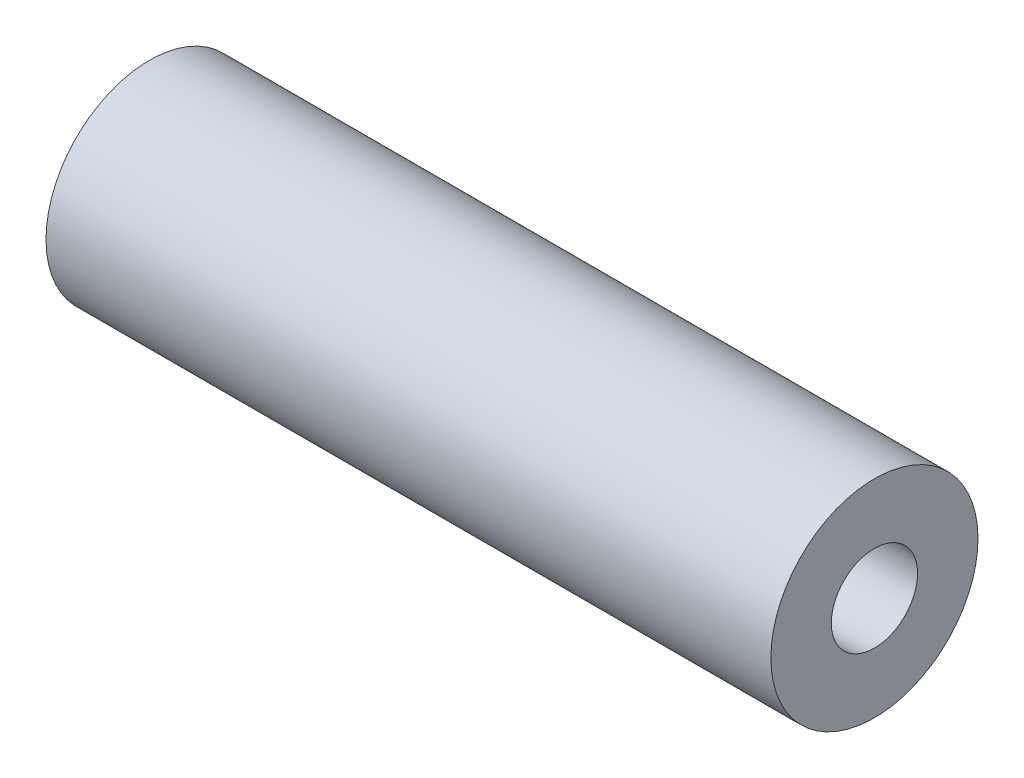
ISO-10303-21;
HEADER;
FILE_DESCRIPTION(('STEP AP214'),'2;1');
FILE_NAME('part.step','',(''),(''),'','','');
FILE_SCHEMA(('AUTOMOTIVE_DESIGN { 1 0 10303 214 1 1 1 1 }'));
ENDSEC;
DATA;
#1=APPLICATION_CONTEXT('core data for automotive mechanical design processes');
#2=APPLICATION_PROTOCOL_DEFINITION('international standard','automotive_design',2000,#1);
#3=PRODUCT_CONTEXT('',#1,'mechanical');
#4=PRODUCT('Part','Part','',(#3));
#5=PRODUCT_RELATED_PRODUCT_CATEGORY('part','',(#4));
#6=PRODUCT_DEFINITION_FORMATION('','',#4);
#7=PRODUCT_DEFINITION_CONTEXT('part definition',#1,'design');
#8=PRODUCT_DEFINITION('design','',#6,#7);
#9=PRODUCT_DEFINITION_SHAPE('','',#8);
#10=(LENGTH_UNIT() NAMED_UNIT(*) SI_UNIT(.MILLI.,.METRE.));
#11=(NAMED_UNIT(*) PLANE_ANGLE_UNIT() SI_UNIT($,.RADIAN.));
#12=(NAMED_UNIT(*) SI_UNIT($,.STERADIAN.) SOLID_ANGLE_UNIT());
#13=UNCERTAINTY_MEASURE_WITH_UNIT(LENGTH_MEASURE(1.E-05),#10,'distance_accuracy_value','');
#14=(GEOMETRIC_REPRESENTATION_CONTEXT(3) GLOBAL_UNCERTAINTY_ASSIGNED_CONTEXT((#13)) GLOBAL_UNIT_ASSIGNED_CONTEXT((#10,
#11,#12)) REPRESENTATION_CONTEXT('',''));
#15=CARTESIAN_POINT('',(0.,0.,0.));
#16=DIRECTION('',(0.,0.,1.));
#17=DIRECTION('',(1.,0.,0.));
#18=AXIS2_PLACEMENT_3D('',#15,#16,#17);
#19=CARTESIAN_POINT('',(21.,0.,0.));
#20=DIRECTION('',(-1.,0.,0.));
#21=DIRECTION('',(0.,0.,1.));
#22=AXIS2_PLACEMENT_3D('',#19,#20,#21);
#23=CYLINDRICAL_SURFACE('',#22,3.);
#24=CARTESIAN_POINT('',(21.,0.,0.));
#25=DIRECTION('',(1.,0.,0.));
#26=DIRECTION('',(0.,0.,-1.));
#27=AXIS2_PLACEMENT_3D('',#24,#25,#26);
#28=CIRCLE('',#27,3.);
#29=CARTESIAN_POINT('',(21.,0.,3.));
#30=VERTEX_POINT('',#29);
#31=EDGE_CURVE('E10',#30,#30,#28,.T.);
#32=CARTESIAN_POINT('',(0.,0.,0.));
#33=DIRECTION('',(1.,0.,0.));
#34=DIRECTION('',(0.,0.,-1.));
#35=AXIS2_PLACEMENT_3D('',#32,#33,#34);
#36=CIRCLE('',#35,3.);
#37=CARTESIAN_POINT('',(0.,0.,3.));
#38=VERTEX_POINT('',#37);
#39=EDGE_CURVE('E37',#38,#38,#36,.T.);
#40=CARTESIAN_POINT('',(21.,0.,3.));
#41=CARTESIAN_POINT('',(20.78125,0.,3.));
#42=CARTESIAN_POINT('',(20.5625,0.,3.));
#43=CARTESIAN_POINT('',(20.125,0.,3.));
#44=CARTESIAN_POINT('',(19.90625,0.,3.));
#45=CARTESIAN_POINT('',(19.46875,0.,3.));
#46=CARTESIAN_POINT('',(19.25,0.,3.));
#47=CARTESIAN_POINT('',(18.8125,0.,3.));
#48=CARTESIAN_POINT('',(18.59375,0.,3.));
#49=CARTESIAN_POINT('',(18.15625,0.,3.));
#50=CARTESIAN_POINT('',(17.9375,0.,3.));
#51=CARTESIAN_POINT('',(17.5,0.,3.));
#52=CARTESIAN_POINT('',(17.28125,0.,3.));
#53=CARTESIAN_POINT('',(16.84375,0.,3.));
#54=CARTESIAN_POINT('',(16.625,0.,3.));
#55=CARTESIAN_POINT('',(16.1875,0.,3.));
#56=CARTESIAN_POINT('',(15.96875,0.,3.));
#57=CARTESIAN_POINT('',(15.53125,0.,3.));
#58=CARTESIAN_POINT('',(15.3125,0.,3.));
#59=CARTESIAN_POINT('',(14.875,0.,3.));
#60=CARTESIAN_POINT('',(14.65625,0.,3.));
#61=CARTESIAN_POINT('',(14.21875,0.,3.));
#62=CARTESIAN_POINT('',(14.,0.,3.));
#63=CARTESIAN_POINT('',(13.5625,0.,3.));
#64=CARTESIAN_POINT('',(13.34375,0.,3.));
#65=CARTESIAN_POINT('',(12.90625,0.,3.));
#66=CARTESIAN_POINT('',(12.6875,0.,3.));
#67=CARTESIAN_POINT('',(12.25,0.,3.));
#68=CARTESIAN_POINT('',(12.03125,0.,3.));
#69=CARTESIAN_POINT('',(11.59375,0.,3.));
#70=CARTESIAN_POINT('',(11.375,0.,3.));
#71=CARTESIAN_POINT('',(10.9375,0.,3.));
#72=CARTESIAN_POINT('',(10.71875,0.,3.));
#73=CARTESIAN_POINT('',(10.28125,0.,3.));
#74=CARTESIAN_POINT('',(10.0625,0.,3.));
#75=CARTESIAN_POINT('',(9.625,0.,3.));
#76=CARTESIAN_POINT('',(9.40625,0.,3.));
#77=CARTESIAN_POINT('',(8.96875,0.,3.));
#78=CARTESIAN_POINT('',(8.75,0.,3.));
#79=CARTESIAN_POINT('',(8.3125,0.,3.));
#80=CARTESIAN_POINT('',(8.09375,0.,3.));
#81=CARTESIAN_POINT('',(7.65625,0.,3.));
#82=CARTESIAN_POINT('',(7.4375,0.,3.));
#83=CARTESIAN_POINT('',(7.,0.,3.));
#84=CARTESIAN_POINT('',(6.78125,0.,3.));
#85=CARTESIAN_POINT('',(6.34375,0.,3.));
#86=CARTESIAN_POINT('',(6.125,0.,3.));
#87=CARTESIAN_POINT('',(5.6875,0.,3.));
#88=CARTESIAN_POINT('',(5.46875,0.,3.));
#89=CARTESIAN_POINT('',(5.03125,0.,3.));
#90=CARTESIAN_POINT('',(4.8125,0.,3.));
#91=CARTESIAN_POINT('',(4.375,0.,3.));
#92=CARTESIAN_POINT('',(4.15625,0.,3.));
#93=CARTESIAN_POINT('',(3.71875,0.,3.));
#94=CARTESIAN_POINT('',(3.5,0.,3.));
#95=CARTESIAN_POINT('',(3.0625,0.,3.));
#96=CARTESIAN_POINT('',(2.84375,0.,3.));
#97=CARTESIAN_POINT('',(2.40625,0.,3.));
#98=CARTESIAN_POINT('',(2.1875,0.,3.));
#99=CARTESIAN_POINT('',(1.75,0.,3.));
#100=CARTESIAN_POINT('',(1.53125,0.,3.));
#101=CARTESIAN_POINT('',(1.09375,0.,3.));
#102=CARTESIAN_POINT('',(0.875000000000001,0.,3.));
#103=CARTESIAN_POINT('',(0.4375,0.,3.));
#104=CARTESIAN_POINT('',(0.21875,0.,3.));
#105=CARTESIAN_POINT('',(0.,0.,3.));
#106=B_SPLINE_CURVE_WITH_KNOTS('',3,(#40,#41,#42,#43,#44,#45,#46,#47,#48,#49,#50,#51,#52,#53,
#54,#55,#56,#57,#58,#59,#60,#61,#62,#63,#64,#65,#66,#67,#68,#69,#70,#71,#72,#73,#74,#75,#76,#77,
#78,#79,#80,#81,#82,#83,#84,#85,#86,#87,#88,#89,#90,#91,#92,#93,#94,#95,#96,#97,#98,#99,#100,
#101,#102,#103,#104,#105),.UNSPECIFIED.,.F.,.F.,(4,2,2,2,2,2,2,2,2,2,2,2,2,2,2,2,2,2,2,2,2,2,2,
2,2,2,2,2,2,2,2,2,4),(0.,0.656249999999997,1.3125,1.96875,2.625,3.28125,3.9375,4.59375,5.25,
5.90625,6.5625,7.21875,7.875,8.53125,9.1875,9.84375,10.5,11.15625,11.8125,12.46875,13.125,
13.78125,14.4375,15.09375,15.75,16.40625,17.0625,17.71875,18.375,19.03125,19.6875,20.34375,21.),.UNSPECIFIED.);
#107=EDGE_CURVE('BSEAM34',#30,#38,#106,.T.);
#108=ORIENTED_EDGE('',*,*,#31,.F.);
#109=ORIENTED_EDGE('',*,*,#39,.T.);
#110=ORIENTED_EDGE('',*,*,#107,.T.);
#111=ORIENTED_EDGE('',*,*,#107,.F.);
#112=EDGE_LOOP('',(#108,#110,#109,#111));
#113=FACE_BOUND('',#112,.T.);
#114=ADVANCED_FACE('F34',(#113),#23,.T.);
#115=CARTESIAN_POINT('',(21.,0.,0.));
#116=DIRECTION('',(1.,0.,0.));
#117=DIRECTION('',(0.,0.,-1.));
#118=AXIS2_PLACEMENT_3D('',#115,#116,#117);
#119=PLANE('',#118);
#120=CARTESIAN_POINT('',(21.,0.,0.));
#121=DIRECTION('',(-1.,0.,0.));
#122=DIRECTION('',(0.,0.,1.));
#123=AXIS2_PLACEMENT_3D('',#120,#121,#122);
#124=CIRCLE('',#123,1.25);
#125=CARTESIAN_POINT('',(21.,0.,1.25));
#126=VERTEX_POINT('',#125);
#127=EDGE_CURVE('E44',#126,#126,#124,.T.);
#128=ORIENTED_EDGE('',*,*,#127,.T.);
#129=EDGE_LOOP('',(#128));
#130=FACE_BOUND('',#129,.T.);
#131=ORIENTED_EDGE('',*,*,#31,.T.);
#132=EDGE_LOOP('',(#131));
#133=FACE_BOUND('',#132,.T.);
#134=ADVANCED_FACE('F52',(#130,#133),#119,.T.);
#135=CARTESIAN_POINT('',(0.,0.,0.));
#136=DIRECTION('',(1.,0.,0.));
#137=DIRECTION('',(0.,0.,-1.));
#138=AXIS2_PLACEMENT_3D('',#135,#136,#137);
#139=PLANE('',#138);
#140=CARTESIAN_POINT('',(0.,0.,0.));
#141=DIRECTION('',(-1.,0.,0.));
#142=DIRECTION('',(0.,0.,1.));
#143=AXIS2_PLACEMENT_3D('',#140,#141,#142);
#144=CIRCLE('',#143,1.25);
#145=CARTESIAN_POINT('',(0.,0.,1.25));
#146=VERTEX_POINT('',#145);
#147=EDGE_CURVE('E46',#146,#146,#144,.T.);
#148=ORIENTED_EDGE('',*,*,#147,.F.);
#149=EDGE_LOOP('',(#148));
#150=FACE_BOUND('',#149,.T.);
#151=ORIENTED_EDGE('',*,*,#39,.F.);
#152=EDGE_LOOP('',(#151));
#153=FACE_BOUND('',#152,.T.);
#154=ADVANCED_FACE('F57',(#150,#153),#139,.F.);
#155=CARTESIAN_POINT('',(21.,0.,0.));
#156=DIRECTION('',(-1.,0.,0.));
#157=DIRECTION('',(0.,0.,1.));
#158=AXIS2_PLACEMENT_3D('',#155,#156,#157);
#159=CYLINDRICAL_SURFACE('',#158,1.25);
#160=CARTESIAN_POINT('',(21.,0.,1.25));
#161=CARTESIAN_POINT('',(20.78125,0.,1.25));
#162=CARTESIAN_POINT('',(20.5625,0.,1.25));
#163=CARTESIAN_POINT('',(20.125,0.,1.25));
#164=CARTESIAN_POINT('',(19.90625,0.,1.25));
#165=CARTESIAN_POINT('',(19.46875,0.,1.25));
#166=CARTESIAN_POINT('',(19.25,0.,1.25));
#167=CARTESIAN_POINT('',(18.8125,0.,1.25));
#168=CARTESIAN_POINT('',(18.59375,0.,1.25));
#169=CARTESIAN_POINT('',(18.15625,0.,1.25));
#170=CARTESIAN_POINT('',(17.9375,0.,1.25));
#171=CARTESIAN_POINT('',(17.5,0.,1.25));
#172=CARTESIAN_POINT('',(17.28125,0.,1.25));
#173=CARTESIAN_POINT('',(16.84375,0.,1.25));
#174=CARTESIAN_POINT('',(16.625,0.,1.25));
#175=CARTESIAN_POINT('',(16.1875,0.,1.25));
#176=CARTESIAN_POINT('',(15.96875,0.,1.25));
#177=CARTESIAN_POINT('',(15.53125,0.,1.25));
#178=CARTESIAN_POINT('',(15.3125,0.,1.25));
#179=CARTESIAN_POINT('',(14.875,0.,1.25));
#180=CARTESIAN_POINT('',(14.65625,0.,1.25));
#181=CARTESIAN_POINT('',(14.21875,0.,1.25));
#182=CARTESIAN_POINT('',(14.,0.,1.25));
#183=CARTESIAN_POINT('',(13.5625,0.,1.25));
#184=CARTESIAN_POINT('',(13.34375,0.,1.25));
#185=CARTESIAN_POINT('',(12.90625,0.,1.25));
#186=CARTESIAN_POINT('',(12.6875,0.,1.25));
#187=CARTESIAN_POINT('',(12.25,0.,1.25));
#188=CARTESIAN_POINT('',(12.03125,0.,1.25));
#189=CARTESIAN_POINT('',(11.59375,0.,1.25));
#190=CARTESIAN_POINT('',(11.375,0.,1.25));
#191=CARTESIAN_POINT('',(10.9375,0.,1.25));
#192=CARTESIAN_POINT('',(10.71875,0.,1.25));
#193=CARTESIAN_POINT('',(10.28125,0.,1.25));
#194=CARTESIAN_POINT('',(10.0625,0.,1.25));
#195=CARTESIAN_POINT('',(9.625,0.,1.25));
#196=CARTESIAN_POINT('',(9.40625,0.,1.25));
#197=CARTESIAN_POINT('',(8.96875,0.,1.25));
#198=CARTESIAN_POINT('',(8.75,0.,1.25));
#199=CARTESIAN_POINT('',(8.3125,0.,1.25));
#200=CARTESIAN_POINT('',(8.09375,0.,1.25));
#201=CARTESIAN_POINT('',(7.65625,0.,1.25));
#202=CARTESIAN_POINT('',(7.4375,0.,1.25));
#203=CARTESIAN_POINT('',(7.,0.,1.25));
#204=CARTESIAN_POINT('',(6.78125,0.,1.25));
#205=CARTESIAN_POINT('',(6.34375,0.,1.25));
#206=CARTESIAN_POINT('',(6.125,0.,1.25));
#207=CARTESIAN_POINT('',(5.6875,0.,1.25));
#208=CARTESIAN_POINT('',(5.46875,0.,1.25));
#209=CARTESIAN_POINT('',(5.03125,0.,1.25));
#210=CARTESIAN_POINT('',(4.8125,0.,1.25));
#211=CARTESIAN_POINT('',(4.375,0.,1.25));
#212=CARTESIAN_POINT('',(4.15625,0.,1.25));
#213=CARTESIAN_POINT('',(3.71875,0.,1.25));
#214=CARTESIAN_POINT('',(3.5,0.,1.25));
#215=CARTESIAN_POINT('',(3.0625,0.,1.25));
#216=CARTESIAN_POINT('',(2.84375,0.,1.25));
#217=CARTESIAN_POINT('',(2.40625,0.,1.25));
#218=CARTESIAN_POINT('',(2.1875,0.,1.25));
#219=CARTESIAN_POINT('',(1.75,0.,1.25));
#220=CARTESIAN_POINT('',(1.53125,0.,1.25));
#221=CARTESIAN_POINT('',(1.09375,0.,1.25));
#222=CARTESIAN_POINT('',(0.875000000000001,0.,1.25));
#223=CARTESIAN_POINT('',(0.4375,0.,1.25));
#224=CARTESIAN_POINT('',(0.21875,0.,1.25));
#225=CARTESIAN_POINT('',(0.,0.,1.25));
#226=B_SPLINE_CURVE_WITH_KNOTS('',3,(#160,#161,#162,#163,#164,#165,#166,#167,#168,#169,#170,
#171,#172,#173,#174,#175,#176,#177,#178,#179,#180,#181,#182,#183,#184,#185,#186,#187,#188,#189,
#190,#191,#192,#193,#194,#195,#196,#197,#198,#199,#200,#201,#202,#203,#204,#205,#206,#207,#208,
#209,#210,#211,#212,#213,#214,#215,#216,#217,#218,#219,#220,#221,#222,#223,#224,#225),
.UNSPECIFIED.,.F.,.F.,(4,2,2,2,2,2,2,2,2,2,2,2,2,2,2,2,2,2,2,2,2,2,2,2,2,2,2,2,2,2,2,2,4),(0.,
0.656250000000001,1.3125,1.96875,2.625,3.28125,3.9375,4.59375,5.25,5.90625,6.5625,7.21875,7.875,
8.53125,9.1875,9.84375,10.5,11.15625,11.8125,12.46875,13.125,13.78125,14.4375,15.09375,15.75,
16.40625,17.0625,17.71875,18.375,19.03125,19.6875,20.34375,21.),.UNSPECIFIED.);
#227=EDGE_CURVE('BSEAM54',#126,#146,#226,.T.);
#228=ORIENTED_EDGE('',*,*,#127,.F.);
#229=ORIENTED_EDGE('',*,*,#147,.T.);
#230=ORIENTED_EDGE('',*,*,#227,.T.);
#231=ORIENTED_EDGE('',*,*,#227,.F.);
#232=EDGE_LOOP('',(#228,#230,#229,#231));
#233=FACE_BOUND('',#232,.T.);
#234=ADVANCED_FACE('F54',(#233),#159,.F.);
#235=CLOSED_SHELL('',(#114,#134,#154,#234));
#236=MANIFOLD_SOLID_BREP('B2',#235);
#237=ADVANCED_BREP_SHAPE_REPRESENTATION('',(#18,#236),#14);
#238=SHAPE_DEFINITION_REPRESENTATION(#9,#237);
ENDSEC;
END-ISO-10303-21;
